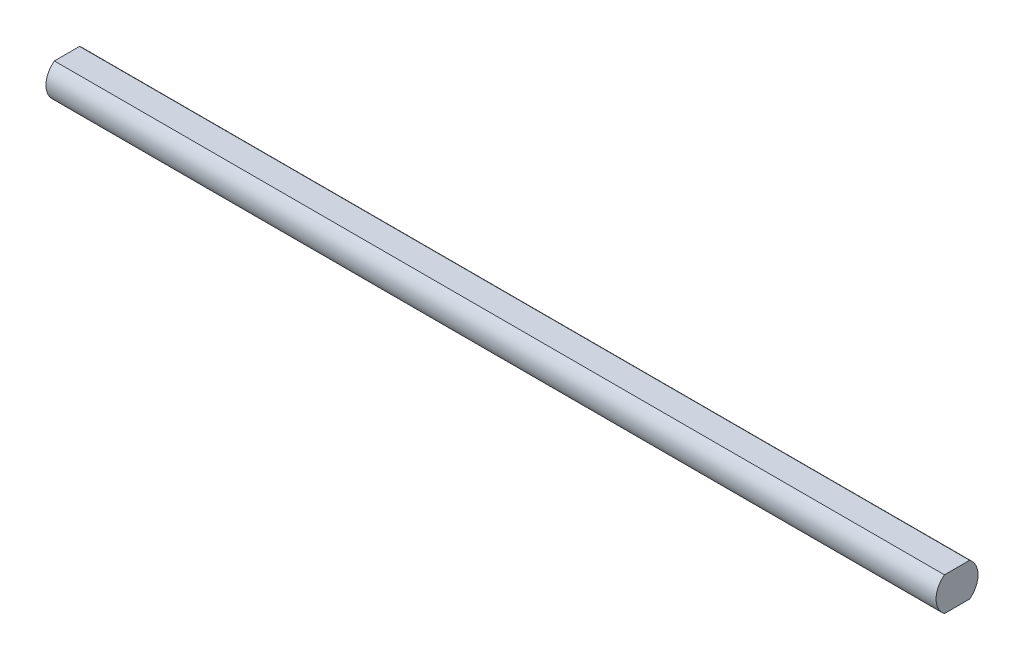
ISO-10303-21;
HEADER;
FILE_DESCRIPTION(('STEP AP214'),'2;1');
FILE_NAME('part.step','',(''),(''),'','','');
FILE_SCHEMA(('AUTOMOTIVE_DESIGN { 1 0 10303 214 1 1 1 1 }'));
ENDSEC;
DATA;
#1=APPLICATION_CONTEXT('core data for automotive mechanical design processes');
#2=APPLICATION_PROTOCOL_DEFINITION('international standard','automotive_design',2000,#1);
#3=PRODUCT_CONTEXT('',#1,'mechanical');
#4=PRODUCT('Part','Part','',(#3));
#5=PRODUCT_RELATED_PRODUCT_CATEGORY('part','',(#4));
#6=PRODUCT_DEFINITION_FORMATION('','',#4);
#7=PRODUCT_DEFINITION_CONTEXT('part definition',#1,'design');
#8=PRODUCT_DEFINITION('design','',#6,#7);
#9=PRODUCT_DEFINITION_SHAPE('','',#8);
#10=(LENGTH_UNIT() NAMED_UNIT(*) SI_UNIT(.MILLI.,.METRE.));
#11=(NAMED_UNIT(*) PLANE_ANGLE_UNIT() SI_UNIT($,.RADIAN.));
#12=(NAMED_UNIT(*) SI_UNIT($,.STERADIAN.) SOLID_ANGLE_UNIT());
#13=UNCERTAINTY_MEASURE_WITH_UNIT(LENGTH_MEASURE(1.E-05),#10,'distance_accuracy_value','');
#14=(GEOMETRIC_REPRESENTATION_CONTEXT(3) GLOBAL_UNCERTAINTY_ASSIGNED_CONTEXT((#13)) GLOBAL_UNIT_ASSIGNED_CONTEXT((#10,
#11,#12)) REPRESENTATION_CONTEXT('',''));
#15=CARTESIAN_POINT('',(0.,0.,0.));
#16=DIRECTION('',(0.,0.,1.));
#17=DIRECTION('',(1.,0.,0.));
#18=AXIS2_PLACEMENT_3D('',#15,#16,#17);
#19=CARTESIAN_POINT('',(-106.,-5.,0.));
#20=DIRECTION('',(-1.,0.,0.));
#21=DIRECTION('',(0.,0.,1.));
#22=AXIS2_PLACEMENT_3D('',#19,#20,#21);
#23=PLANE('',#22);
#24=CARTESIAN_POINT('',(-106.,0.,0.));
#25=DIRECTION('',(-1.,0.,0.));
#26=DIRECTION('',(0.,0.,1.));
#27=AXIS2_PLACEMENT_3D('',#24,#25,#26);
#28=CIRCLE('',#27,5.);
#29=CARTESIAN_POINT('',(-106.,4.,-3.));
#30=VERTEX_POINT('',#29);
#31=CARTESIAN_POINT('',(-106.,-4.00000000000002,-2.99999999999998));
#32=VERTEX_POINT('',#31);
#33=EDGE_CURVE('E105',#30,#32,#28,.T.);
#34=ORIENTED_EDGE('',*,*,#33,.T.);
#35=DIRECTION('',(0.,0.,-1.));
#36=VECTOR('',#35,1.);
#37=CARTESIAN_POINT('',(-106.,-4.00000000000002,0.));
#38=LINE('',#37,#36);
#39=CARTESIAN_POINT('',(-106.,-4.00000000000002,2.99999999999998));
#40=VERTEX_POINT('',#39);
#41=EDGE_CURVE('E61',#40,#32,#38,.T.);
#42=ORIENTED_EDGE('',*,*,#41,.F.);
#43=CARTESIAN_POINT('',(-106.,4.,3.));
#44=VERTEX_POINT('',#43);
#45=EDGE_CURVE('E101',#40,#44,#28,.T.);
#46=ORIENTED_EDGE('',*,*,#45,.T.);
#47=DIRECTION('',(0.,0.,-1.));
#48=VECTOR('',#47,1.);
#49=CARTESIAN_POINT('',(-106.,4.,3.));
#50=LINE('',#49,#48);
#51=EDGE_CURVE('E108',#44,#30,#50,.T.);
#52=ORIENTED_EDGE('',*,*,#51,.T.);
#53=EDGE_LOOP('',(#34,#42,#46,#52));
#54=FACE_BOUND('',#53,.T.);
#55=ADVANCED_FACE('F46',(#54),#23,.T.);
#56=CARTESIAN_POINT('',(106.,0.,0.));
#57=DIRECTION('',(1.,0.,0.));
#58=DIRECTION('',(0.,0.,-1.));
#59=AXIS2_PLACEMENT_3D('',#56,#57,#58);
#60=PLANE('',#59);
#61=CARTESIAN_POINT('',(106.,0.,0.));
#62=DIRECTION('',(-1.,0.,0.));
#63=DIRECTION('',(0.,0.,1.));
#64=AXIS2_PLACEMENT_3D('',#61,#62,#63);
#65=CIRCLE('',#64,5.);
#66=CARTESIAN_POINT('',(106.,-4.00000000000002,2.99999999999998));
#67=VERTEX_POINT('',#66);
#68=CARTESIAN_POINT('',(106.,4.,3.));
#69=VERTEX_POINT('',#68);
#70=EDGE_CURVE('E49',#67,#69,#65,.T.);
#71=ORIENTED_EDGE('',*,*,#70,.F.);
#72=DIRECTION('',(0.,0.,-1.));
#73=VECTOR('',#72,1.);
#74=CARTESIAN_POINT('',(106.,-4.00000000000002,0.));
#75=LINE('',#74,#73);
#76=CARTESIAN_POINT('',(106.,-4.00000000000002,-2.99999999999998));
#77=VERTEX_POINT('',#76);
#78=EDGE_CURVE('E87',#67,#77,#75,.T.);
#79=ORIENTED_EDGE('',*,*,#78,.T.);
#80=CARTESIAN_POINT('',(106.,4.,-3.));
#81=VERTEX_POINT('',#80);
#82=EDGE_CURVE('E12',#81,#77,#65,.T.);
#83=ORIENTED_EDGE('',*,*,#82,.F.);
#84=DIRECTION('',(0.,0.,-1.));
#85=VECTOR('',#84,1.);
#86=CARTESIAN_POINT('',(106.,4.,3.));
#87=LINE('',#86,#85);
#88=EDGE_CURVE('E69',#69,#81,#87,.T.);
#89=ORIENTED_EDGE('',*,*,#88,.F.);
#90=EDGE_LOOP('',(#71,#79,#83,#89));
#91=FACE_BOUND('',#90,.T.);
#92=ADVANCED_FACE('F98',(#91),#60,.T.);
#93=CARTESIAN_POINT('',(-106.,0.,0.));
#94=DIRECTION('',(-1.,0.,0.));
#95=DIRECTION('',(0.,0.,1.));
#96=AXIS2_PLACEMENT_3D('',#93,#94,#95);
#97=CYLINDRICAL_SURFACE('',#96,5.);
#98=ORIENTED_EDGE('',*,*,#45,.F.);
#99=DIRECTION('',(1.,0.,0.));
#100=VECTOR('',#99,1.);
#101=CARTESIAN_POINT('',(-112.082762530298,-4.00000000000002,2.99999999999998));
#102=LINE('',#101,#100);
#103=EDGE_CURVE('E93',#40,#67,#102,.T.);
#104=ORIENTED_EDGE('',*,*,#103,.T.);
#105=ORIENTED_EDGE('',*,*,#70,.T.);
#106=DIRECTION('',(1.,0.,0.));
#107=VECTOR('',#106,1.);
#108=CARTESIAN_POINT('',(-112.082762530298,4.,3.));
#109=LINE('',#108,#107);
#110=EDGE_CURVE('E109',#44,#69,#109,.T.);
#111=ORIENTED_EDGE('',*,*,#110,.F.);
#112=EDGE_LOOP('',(#98,#104,#105,#111));
#113=FACE_BOUND('',#112,.T.);
#114=ADVANCED_FACE('F126',(#113),#97,.T.);
#115=ORIENTED_EDGE('',*,*,#82,.T.);
#116=DIRECTION('',(1.,0.,0.));
#117=VECTOR('',#116,1.);
#118=CARTESIAN_POINT('',(-112.082762530298,-4.00000000000002,-2.99999999999998));
#119=LINE('',#118,#117);
#120=EDGE_CURVE('E84',#32,#77,#119,.T.);
#121=ORIENTED_EDGE('',*,*,#120,.F.);
#122=ORIENTED_EDGE('',*,*,#33,.F.);
#123=DIRECTION('',(1.,0.,0.));
#124=VECTOR('',#123,1.);
#125=CARTESIAN_POINT('',(-112.082762530298,4.,-3.));
#126=LINE('',#125,#124);
#127=EDGE_CURVE('E104',#30,#81,#126,.T.);
#128=ORIENTED_EDGE('',*,*,#127,.T.);
#129=EDGE_LOOP('',(#115,#121,#122,#128));
#130=FACE_BOUND('',#129,.T.);
#131=ADVANCED_FACE('F103',(#130),#97,.T.);
#132=CARTESIAN_POINT('',(-112.082762530298,4.,3.));
#133=DIRECTION('',(0.,-1.,0.));
#134=DIRECTION('',(0.,0.,-1.));
#135=AXIS2_PLACEMENT_3D('',#132,#133,#134);
#136=PLANE('',#135);
#137=ORIENTED_EDGE('',*,*,#110,.T.);
#138=ORIENTED_EDGE('',*,*,#88,.T.);
#139=ORIENTED_EDGE('',*,*,#127,.F.);
#140=ORIENTED_EDGE('',*,*,#51,.F.);
#141=EDGE_LOOP('',(#137,#138,#139,#140));
#142=FACE_BOUND('',#141,.T.);
#143=ADVANCED_FACE('F139',(#142),#136,.F.);
#144=CARTESIAN_POINT('',(-112.082762530298,-4.00000000000002,0.));
#145=DIRECTION('',(0.,-1.,0.));
#146=DIRECTION('',(0.,0.,-1.));
#147=AXIS2_PLACEMENT_3D('',#144,#145,#146);
#148=PLANE('',#147);
#149=ORIENTED_EDGE('',*,*,#41,.T.);
#150=ORIENTED_EDGE('',*,*,#120,.T.);
#151=ORIENTED_EDGE('',*,*,#78,.F.);
#152=ORIENTED_EDGE('',*,*,#103,.F.);
#153=EDGE_LOOP('',(#149,#150,#151,#152));
#154=FACE_BOUND('',#153,.T.);
#155=ADVANCED_FACE('F86',(#154),#148,.T.);
#156=CLOSED_SHELL('',(#55,#92,#114,#131,#143,#155));
#157=MANIFOLD_SOLID_BREP('B2',#156);
#158=ADVANCED_BREP_SHAPE_REPRESENTATION('',(#18,#157),#14);
#159=SHAPE_DEFINITION_REPRESENTATION(#9,#158);
ENDSEC;
END-ISO-10303-21;
